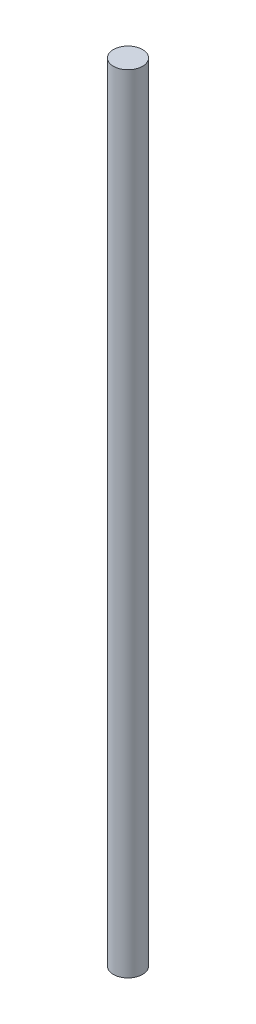
ISO-10303-21;
HEADER;
FILE_DESCRIPTION(('STEP AP214'),'2;1');
FILE_NAME('part.step','',(''),(''),'','','');
FILE_SCHEMA(('AUTOMOTIVE_DESIGN { 1 0 10303 214 1 1 1 1 }'));
ENDSEC;
DATA;
#1=APPLICATION_CONTEXT('core data for automotive mechanical design processes');
#2=APPLICATION_PROTOCOL_DEFINITION('international standard','automotive_design',2000,#1);
#3=PRODUCT_CONTEXT('',#1,'mechanical');
#4=PRODUCT('Part','Part','',(#3));
#5=PRODUCT_RELATED_PRODUCT_CATEGORY('part','',(#4));
#6=PRODUCT_DEFINITION_FORMATION('','',#4);
#7=PRODUCT_DEFINITION_CONTEXT('part definition',#1,'design');
#8=PRODUCT_DEFINITION('design','',#6,#7);
#9=PRODUCT_DEFINITION_SHAPE('','',#8);
#10=(LENGTH_UNIT() NAMED_UNIT(*) SI_UNIT(.MILLI.,.METRE.));
#11=(NAMED_UNIT(*) PLANE_ANGLE_UNIT() SI_UNIT($,.RADIAN.));
#12=(NAMED_UNIT(*) SI_UNIT($,.STERADIAN.) SOLID_ANGLE_UNIT());
#13=UNCERTAINTY_MEASURE_WITH_UNIT(LENGTH_MEASURE(1.E-05),#10,'distance_accuracy_value','');
#14=(GEOMETRIC_REPRESENTATION_CONTEXT(3) GLOBAL_UNCERTAINTY_ASSIGNED_CONTEXT((#13)) GLOBAL_UNIT_ASSIGNED_CONTEXT((#10,
#11,#12)) REPRESENTATION_CONTEXT('',''));
#15=CARTESIAN_POINT('',(0.,0.,0.));
#16=DIRECTION('',(0.,0.,1.));
#17=DIRECTION('',(1.,0.,0.));
#18=AXIS2_PLACEMENT_3D('',#15,#16,#17);
#19=CARTESIAN_POINT('',(0.,100.,0.));
#20=DIRECTION('',(0.,-1.,0.));
#21=DIRECTION('',(0.,0.,-1.));
#22=AXIS2_PLACEMENT_3D('',#19,#20,#21);
#23=CYLINDRICAL_SURFACE('',#22,1.85);
#24=CARTESIAN_POINT('',(0.,100.,0.));
#25=DIRECTION('',(0.,1.,0.));
#26=DIRECTION('',(0.,0.,1.));
#27=AXIS2_PLACEMENT_3D('',#24,#25,#26);
#28=CIRCLE('',#27,1.85);
#29=CARTESIAN_POINT('',(0.,100.,1.85));
#30=VERTEX_POINT('',#29);
#31=EDGE_CURVE('E10',#30,#30,#28,.T.);
#32=ORIENTED_EDGE('',*,*,#31,.F.);
#33=EDGE_LOOP('',(#32));
#34=FACE_BOUND('',#33,.T.);
#35=CARTESIAN_POINT('',(0.,0.,0.));
#36=DIRECTION('',(0.,1.,0.));
#37=DIRECTION('',(0.,0.,1.));
#38=AXIS2_PLACEMENT_3D('',#35,#36,#37);
#39=CIRCLE('',#38,1.85);
#40=CARTESIAN_POINT('',(0.,0.,1.85));
#41=VERTEX_POINT('',#40);
#42=EDGE_CURVE('E34',#41,#41,#39,.T.);
#43=ORIENTED_EDGE('',*,*,#42,.T.);
#44=EDGE_LOOP('',(#43));
#45=FACE_BOUND('',#44,.T.);
#46=ADVANCED_FACE('F31',(#34,#45),#23,.T.);
#47=CARTESIAN_POINT('',(0.,100.,0.));
#48=DIRECTION('',(0.,1.,0.));
#49=DIRECTION('',(0.,0.,1.));
#50=AXIS2_PLACEMENT_3D('',#47,#48,#49);
#51=PLANE('',#50);
#52=ORIENTED_EDGE('',*,*,#31,.T.);
#53=EDGE_LOOP('',(#52));
#54=FACE_BOUND('',#53,.T.);
#55=ADVANCED_FACE('F46',(#54),#51,.T.);
#56=CARTESIAN_POINT('',(0.,0.,0.));
#57=DIRECTION('',(0.,1.,0.));
#58=DIRECTION('',(0.,0.,1.));
#59=AXIS2_PLACEMENT_3D('',#56,#57,#58);
#60=PLANE('',#59);
#61=ORIENTED_EDGE('',*,*,#42,.F.);
#62=EDGE_LOOP('',(#61));
#63=FACE_BOUND('',#62,.T.);
#64=ADVANCED_FACE('F44',(#63),#60,.F.);
#65=CLOSED_SHELL('',(#46,#55,#64));
#66=MANIFOLD_SOLID_BREP('B2',#65);
#67=ADVANCED_BREP_SHAPE_REPRESENTATION('',(#18,#66),#14);
#68=SHAPE_DEFINITION_REPRESENTATION(#9,#67);
ENDSEC;
END-ISO-10303-21;
